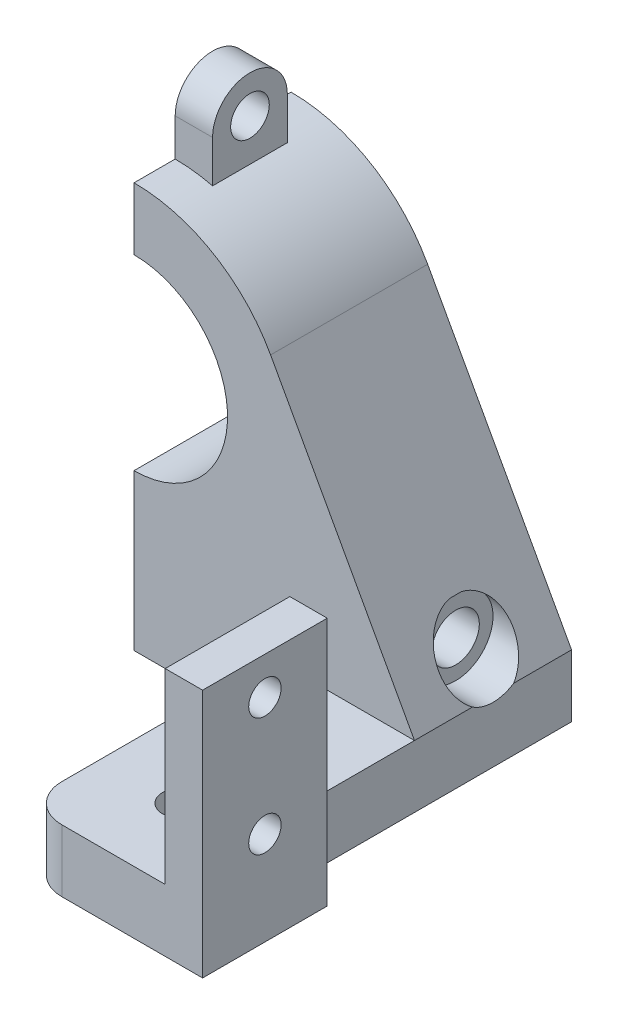
ISO-10303-21;
HEADER;
FILE_DESCRIPTION(('STEP AP214'),'2;1');
FILE_NAME('part.step','',(''),(''),'','','');
FILE_SCHEMA(('AUTOMOTIVE_DESIGN { 1 0 10303 214 1 1 1 1 }'));
ENDSEC;
DATA;
#1=APPLICATION_CONTEXT('core data for automotive mechanical design processes');
#2=APPLICATION_PROTOCOL_DEFINITION('international standard','automotive_design',2000,#1);
#3=PRODUCT_CONTEXT('',#1,'mechanical');
#4=PRODUCT('Part','Part','',(#3));
#5=PRODUCT_RELATED_PRODUCT_CATEGORY('part','',(#4));
#6=PRODUCT_DEFINITION_FORMATION('','',#4);
#7=PRODUCT_DEFINITION_CONTEXT('part definition',#1,'design');
#8=PRODUCT_DEFINITION('design','',#6,#7);
#9=PRODUCT_DEFINITION_SHAPE('','',#8);
#10=(LENGTH_UNIT() NAMED_UNIT(*) SI_UNIT(.MILLI.,.METRE.));
#11=(NAMED_UNIT(*) PLANE_ANGLE_UNIT() SI_UNIT($,.RADIAN.));
#12=(NAMED_UNIT(*) SI_UNIT($,.STERADIAN.) SOLID_ANGLE_UNIT());
#13=UNCERTAINTY_MEASURE_WITH_UNIT(LENGTH_MEASURE(1.E-05),#10,'distance_accuracy_value','');
#14=(GEOMETRIC_REPRESENTATION_CONTEXT(3) GLOBAL_UNCERTAINTY_ASSIGNED_CONTEXT((#13)) GLOBAL_UNIT_ASSIGNED_CONTEXT((#10,
#11,#12)) REPRESENTATION_CONTEXT('',''));
#15=CARTESIAN_POINT('',(0.,0.,0.));
#16=DIRECTION('',(0.,0.,1.));
#17=DIRECTION('',(1.,0.,0.));
#18=AXIS2_PLACEMENT_3D('',#15,#16,#17);
#19=CARTESIAN_POINT('',(25.5,-12.5,6.3));
#20=DIRECTION('',(-1.,0.,0.));
#21=DIRECTION('',(0.,0.,1.));
#22=AXIS2_PLACEMENT_3D('',#19,#20,#21);
#23=CYLINDRICAL_SURFACE('',#22,1.90095655825944);
#24=CARTESIAN_POINT('',(0.,-12.5,6.3));
#25=DIRECTION('',(1.,0.,0.));
#26=DIRECTION('',(0.,0.,-1.));
#27=AXIS2_PLACEMENT_3D('',#24,#25,#26);
#28=CIRCLE('',#27,1.90095655825944);
#29=CARTESIAN_POINT('',(0.,-12.5,4.39904344174055));
#30=VERTEX_POINT('',#29);
#31=EDGE_CURVE('E193',#30,#30,#28,.T.);
#32=ORIENTED_EDGE('',*,*,#31,.F.);
#33=EDGE_LOOP('',(#32));
#34=FACE_BOUND('',#33,.T.);
#35=CARTESIAN_POINT('',(19.5,-12.5,6.3));
#36=DIRECTION('',(1.,0.,0.));
#37=DIRECTION('',(0.,0.,-1.));
#38=AXIS2_PLACEMENT_3D('',#35,#36,#37);
#39=CIRCLE('',#38,1.90095655825944);
#40=CARTESIAN_POINT('',(19.5,-12.5,4.39904344174055));
#41=VERTEX_POINT('',#40);
#42=EDGE_CURVE('E194',#41,#41,#39,.T.);
#43=ORIENTED_EDGE('',*,*,#42,.T.);
#44=EDGE_LOOP('',(#43));
#45=FACE_BOUND('',#44,.T.);
#46=ADVANCED_FACE('F51',(#34,#45),#23,.F.);
#47=CARTESIAN_POINT('',(0.,0.,12.6));
#48=DIRECTION('',(0.,0.,-1.));
#49=DIRECTION('',(-1.,0.,0.));
#50=AXIS2_PLACEMENT_3D('',#47,#48,#49);
#51=CYLINDRICAL_SURFACE('',#50,12.5);
#52=CARTESIAN_POINT('',(0.,0.,3.3));
#53=DIRECTION('',(0.,0.,1.));
#54=DIRECTION('',(1.,0.,0.));
#55=AXIS2_PLACEMENT_3D('',#52,#53,#54);
#56=CIRCLE('',#55,12.5);
#57=CARTESIAN_POINT('',(3.,12.1346610995116,3.3));
#58=VERTEX_POINT('',#57);
#59=CARTESIAN_POINT('',(0.,12.5,3.3));
#60=VERTEX_POINT('',#59);
#61=EDGE_CURVE('E416',#58,#60,#56,.T.);
#62=ORIENTED_EDGE('',*,*,#61,.F.);
#63=DIRECTION('',(0.,0.,-1.));
#64=VECTOR('',#63,1.);
#65=CARTESIAN_POINT('',(3.,12.1346610995116,12.6));
#66=LINE('',#65,#64);
#67=CARTESIAN_POINT('',(3.,12.1346610995116,9.3));
#68=VERTEX_POINT('',#67);
#69=EDGE_CURVE('E74',#58,#68,#66,.F.);
#70=ORIENTED_EDGE('',*,*,#69,.T.);
#71=CARTESIAN_POINT('',(0.,0.,9.3));
#72=DIRECTION('',(0.,0.,-1.));
#73=DIRECTION('',(-1.,0.,0.));
#74=AXIS2_PLACEMENT_3D('',#71,#72,#73);
#75=CIRCLE('',#74,12.5);
#76=CARTESIAN_POINT('',(0.,12.5,9.3));
#77=VERTEX_POINT('',#76);
#78=EDGE_CURVE('E428',#77,#68,#75,.T.);
#79=ORIENTED_EDGE('',*,*,#78,.F.);
#80=DIRECTION('',(0.,0.,-1.));
#81=VECTOR('',#80,1.);
#82=CARTESIAN_POINT('',(0.,12.5,12.6));
#83=LINE('',#82,#81);
#84=CARTESIAN_POINT('',(0.,12.5,12.6));
#85=VERTEX_POINT('',#84);
#86=EDGE_CURVE('E423',#77,#85,#83,.F.);
#87=ORIENTED_EDGE('',*,*,#86,.T.);
#88=CARTESIAN_POINT('',(0.,0.,12.6));
#89=DIRECTION('',(0.,0.,1.));
#90=DIRECTION('',(1.,0.,0.));
#91=AXIS2_PLACEMENT_3D('',#88,#89,#90);
#92=CIRCLE('',#91,12.5);
#93=CARTESIAN_POINT('',(10.9561942606573,6.01762472431933,12.6));
#94=VERTEX_POINT('',#93);
#95=EDGE_CURVE('E372',#94,#85,#92,.T.);
#96=ORIENTED_EDGE('',*,*,#95,.F.);
#97=DIRECTION('',(0.,0.,-1.));
#98=VECTOR('',#97,1.);
#99=CARTESIAN_POINT('',(10.9561942606573,6.01762472431933,12.6));
#100=LINE('',#99,#98);
#101=CARTESIAN_POINT('',(10.9561942606573,6.01762472431933,0.));
#102=VERTEX_POINT('',#101);
#103=EDGE_CURVE('E223',#94,#102,#100,.T.);
#104=ORIENTED_EDGE('',*,*,#103,.T.);
#105=CARTESIAN_POINT('',(0.,0.,0.));
#106=DIRECTION('',(0.,0.,1.));
#107=DIRECTION('',(1.,0.,0.));
#108=AXIS2_PLACEMENT_3D('',#105,#106,#107);
#109=CIRCLE('',#108,12.5);
#110=CARTESIAN_POINT('',(0.,12.5,0.));
#111=VERTEX_POINT('',#110);
#112=EDGE_CURVE('E385',#102,#111,#109,.T.);
#113=ORIENTED_EDGE('',*,*,#112,.T.);
#114=EDGE_CURVE('E431',#111,#60,#83,.F.);
#115=ORIENTED_EDGE('',*,*,#114,.T.);
#116=EDGE_LOOP('',(#62,#70,#79,#87,#96,#104,#113,#115));
#117=FACE_BOUND('',#116,.T.);
#118=ADVANCED_FACE('F265',(#117),#51,.T.);
#119=CARTESIAN_POINT('',(22.5,-15.,12.6));
#120=DIRECTION('',(-1.,0.,0.));
#121=DIRECTION('',(0.,0.,1.));
#122=AXIS2_PLACEMENT_3D('',#119,#120,#121);
#123=PLANE('',#122);
#124=DIRECTION('',(0.,0.,-1.));
#125=VECTOR('',#124,1.);
#126=CARTESIAN_POINT('',(22.5,-15.,12.6));
#127=LINE('',#126,#125);
#128=CARTESIAN_POINT('',(22.5,-15.,4.64168760482227));
#129=VERTEX_POINT('',#128);
#130=CARTESIAN_POINT('',(22.5,-15.,0.));
#131=VERTEX_POINT('',#130);
#132=EDGE_CURVE('E213',#129,#131,#127,.T.);
#133=ORIENTED_EDGE('',*,*,#132,.F.);
#134=CARTESIAN_POINT('',(22.5,-12.5,6.3));
#135=DIRECTION('',(1.,0.,0.));
#136=DIRECTION('',(0.,0.,-1.));
#137=AXIS2_PLACEMENT_3D('',#134,#135,#136);
#138=CIRCLE('',#137,3.);
#139=CARTESIAN_POINT('',(22.5,-15.,7.95831239517772));
#140=VERTEX_POINT('',#139);
#141=EDGE_CURVE('E200',#140,#129,#138,.T.);
#142=ORIENTED_EDGE('',*,*,#141,.F.);
#143=CARTESIAN_POINT('',(22.5,-15.,12.6));
#144=VERTEX_POINT('',#143);
#145=EDGE_CURVE('E206',#144,#140,#127,.T.);
#146=ORIENTED_EDGE('',*,*,#145,.F.);
#147=DIRECTION('',(0.,0.,-1.));
#148=VECTOR('',#147,1.);
#149=CARTESIAN_POINT('',(22.5,-15.,32.6));
#150=LINE('',#149,#148);
#151=CARTESIAN_POINT('',(22.5,-15.,22.6));
#152=VERTEX_POINT('',#151);
#153=EDGE_CURVE('E231',#152,#144,#150,.T.);
#154=ORIENTED_EDGE('',*,*,#153,.F.);
#155=DIRECTION('',(0.,1.,0.));
#156=VECTOR('',#155,1.);
#157=CARTESIAN_POINT('',(22.5,-20.,22.6));
#158=LINE('',#157,#156);
#159=CARTESIAN_POINT('',(22.5,-20.,22.6));
#160=VERTEX_POINT('',#159);
#161=EDGE_CURVE('E492',#160,#152,#158,.T.);
#162=ORIENTED_EDGE('',*,*,#161,.F.);
#163=DIRECTION('',(0.,0.,-1.));
#164=VECTOR('',#163,1.);
#165=CARTESIAN_POINT('',(22.5,-20.,12.6));
#166=LINE('',#165,#164);
#167=CARTESIAN_POINT('',(22.5,-20.,0.));
#168=VERTEX_POINT('',#167);
#169=EDGE_CURVE('E212',#160,#168,#166,.T.);
#170=ORIENTED_EDGE('',*,*,#169,.T.);
#171=DIRECTION('',(0.,1.,0.));
#172=VECTOR('',#171,1.);
#173=CARTESIAN_POINT('',(22.5,-15.,0.));
#174=LINE('',#173,#172);
#175=EDGE_CURVE('E393',#168,#131,#174,.T.);
#176=ORIENTED_EDGE('',*,*,#175,.T.);
#177=EDGE_LOOP('',(#133,#142,#146,#154,#162,#170,#176));
#178=FACE_BOUND('',#177,.T.);
#179=ADVANCED_FACE('F270',(#178),#123,.F.);
#180=CARTESIAN_POINT('',(0.,0.,12.6));
#181=DIRECTION('',(0.,0.,1.));
#182=DIRECTION('',(1.,0.,0.));
#183=AXIS2_PLACEMENT_3D('',#180,#181,#182);
#184=PLANE('',#183);
#185=DIRECTION('',(0.,1.,0.));
#186=VECTOR('',#185,1.);
#187=CARTESIAN_POINT('',(0.,0.,12.6));
#188=LINE('',#187,#186);
#189=CARTESIAN_POINT('',(0.,-20.,12.6));
#190=VERTEX_POINT('',#189);
#191=CARTESIAN_POINT('',(0.,-7.5,12.6));
#192=VERTEX_POINT('',#191);
#193=EDGE_CURVE('E425',#190,#192,#188,.T.);
#194=ORIENTED_EDGE('',*,*,#193,.F.);
#195=DIRECTION('',(1.,0.,0.));
#196=VECTOR('',#195,1.);
#197=CARTESIAN_POINT('',(-22.5,-20.,12.6));
#198=LINE('',#197,#196);
#199=CARTESIAN_POINT('',(11.2082511185139,-20.,12.6));
#200=VERTEX_POINT('',#199);
#201=EDGE_CURVE('E363',#190,#200,#198,.T.);
#202=ORIENTED_EDGE('',*,*,#201,.T.);
#203=DIRECTION('',(0.,1.,0.));
#204=VECTOR('',#203,1.);
#205=CARTESIAN_POINT('',(11.2082511185139,0.,12.6));
#206=LINE('',#205,#204);
#207=CARTESIAN_POINT('',(11.2082511185139,-15.,12.6));
#208=VERTEX_POINT('',#207);
#209=EDGE_CURVE('E515',#200,#208,#206,.T.);
#210=ORIENTED_EDGE('',*,*,#209,.T.);
#211=DIRECTION('',(1.,0.,0.));
#212=VECTOR('',#211,1.);
#213=CARTESIAN_POINT('',(0.,-15.,12.6));
#214=LINE('',#213,#212);
#215=EDGE_CURVE('E511',#208,#144,#214,.T.);
#216=ORIENTED_EDGE('',*,*,#215,.T.);
#217=DIRECTION('',(-0.481409977945547,0.876495540852586,0.));
#218=VECTOR('',#217,1.);
#219=CARTESIAN_POINT('',(10.9561942606573,6.01762472431933,12.6));
#220=LINE('',#219,#218);
#221=EDGE_CURVE('E208',#144,#94,#220,.T.);
#222=ORIENTED_EDGE('',*,*,#221,.T.);
#223=ORIENTED_EDGE('',*,*,#95,.T.);
#224=CARTESIAN_POINT('',(0.,7.5,12.6));
#225=VERTEX_POINT('',#224);
#226=EDGE_CURVE('E415',#225,#85,#188,.T.);
#227=ORIENTED_EDGE('',*,*,#226,.F.);
#228=CARTESIAN_POINT('',(0.,0.,12.6));
#229=DIRECTION('',(0.,0.,1.));
#230=DIRECTION('',(1.,0.,0.));
#231=AXIS2_PLACEMENT_3D('',#228,#229,#230);
#232=CIRCLE('',#231,7.5);
#233=EDGE_CURVE('E390',#192,#225,#232,.T.);
#234=ORIENTED_EDGE('',*,*,#233,.F.);
#235=EDGE_LOOP('',(#194,#202,#210,#216,#222,#223,#227,#234));
#236=FACE_BOUND('',#235,.T.);
#237=ADVANCED_FACE('F341',(#236),#184,.T.);
#238=CARTESIAN_POINT('',(0.,0.,0.));
#239=DIRECTION('',(0.,0.,1.));
#240=DIRECTION('',(1.,0.,0.));
#241=AXIS2_PLACEMENT_3D('',#238,#239,#240);
#242=PLANE('',#241);
#243=DIRECTION('',(1.,0.,0.));
#244=VECTOR('',#243,1.);
#245=CARTESIAN_POINT('',(-22.5,-20.,0.));
#246=LINE('',#245,#244);
#247=CARTESIAN_POINT('',(0.,-20.,0.));
#248=VERTEX_POINT('',#247);
#249=EDGE_CURVE('E389',#248,#168,#246,.T.);
#250=ORIENTED_EDGE('',*,*,#249,.F.);
#251=DIRECTION('',(0.,1.,0.));
#252=VECTOR('',#251,1.);
#253=CARTESIAN_POINT('',(0.,0.,0.));
#254=LINE('',#253,#252);
#255=CARTESIAN_POINT('',(0.,-7.5,0.));
#256=VERTEX_POINT('',#255);
#257=EDGE_CURVE('E418',#248,#256,#254,.T.);
#258=ORIENTED_EDGE('',*,*,#257,.T.);
#259=CARTESIAN_POINT('',(0.,0.,0.));
#260=DIRECTION('',(0.,0.,1.));
#261=DIRECTION('',(1.,0.,0.));
#262=AXIS2_PLACEMENT_3D('',#259,#260,#261);
#263=CIRCLE('',#262,7.5);
#264=CARTESIAN_POINT('',(0.,7.5,0.));
#265=VERTEX_POINT('',#264);
#266=EDGE_CURVE('E411',#256,#265,#263,.T.);
#267=ORIENTED_EDGE('',*,*,#266,.T.);
#268=EDGE_CURVE('E408',#265,#111,#254,.T.);
#269=ORIENTED_EDGE('',*,*,#268,.T.);
#270=ORIENTED_EDGE('',*,*,#112,.F.);
#271=DIRECTION('',(-0.481409977945547,0.876495540852586,0.));
#272=VECTOR('',#271,1.);
#273=CARTESIAN_POINT('',(10.9561942606573,6.01762472431933,0.));
#274=LINE('',#273,#272);
#275=EDGE_CURVE('E381',#131,#102,#274,.T.);
#276=ORIENTED_EDGE('',*,*,#275,.F.);
#277=ORIENTED_EDGE('',*,*,#175,.F.);
#278=EDGE_LOOP('',(#250,#258,#267,#269,#270,#276,#277));
#279=FACE_BOUND('',#278,.T.);
#280=ADVANCED_FACE('F344',(#279),#242,.F.);
#281=CARTESIAN_POINT('',(-22.5,-20.,12.6));
#282=DIRECTION('',(0.,1.,0.));
#283=DIRECTION('',(-1.,0.,0.));
#284=AXIS2_PLACEMENT_3D('',#281,#282,#283);
#285=PLANE('',#284);
#286=CARTESIAN_POINT('',(17.5,-20.,26.3));
#287=DIRECTION('',(0.,1.,0.));
#288=DIRECTION('',(0.,0.,-1.));
#289=AXIS2_PLACEMENT_3D('',#286,#287,#288);
#290=CIRCLE('',#289,1.5);
#291=CARTESIAN_POINT('',(17.5,-20.,24.8));
#292=VERTEX_POINT('',#291);
#293=EDGE_CURVE('E232',#292,#292,#290,.T.);
#294=ORIENTED_EDGE('',*,*,#293,.T.);
#295=EDGE_LOOP('',(#294));
#296=FACE_BOUND('',#295,.T.);
#297=ORIENTED_EDGE('',*,*,#201,.F.);
#298=DIRECTION('',(0.,0.,-1.));
#299=VECTOR('',#298,1.);
#300=CARTESIAN_POINT('',(0.,-20.,12.6));
#301=LINE('',#300,#299);
#302=EDGE_CURVE('E364',#190,#248,#301,.T.);
#303=ORIENTED_EDGE('',*,*,#302,.T.);
#304=ORIENTED_EDGE('',*,*,#249,.T.);
#305=ORIENTED_EDGE('',*,*,#169,.F.);
#306=DIRECTION('',(-1.,0.,0.));
#307=VECTOR('',#306,1.);
#308=CARTESIAN_POINT('',(25.5,-20.,22.6));
#309=LINE('',#308,#307);
#310=CARTESIAN_POINT('',(25.5,-20.,22.6));
#311=VERTEX_POINT('',#310);
#312=EDGE_CURVE('E460',#311,#160,#309,.T.);
#313=ORIENTED_EDGE('',*,*,#312,.F.);
#314=DIRECTION('',(0.,0.,-1.));
#315=VECTOR('',#314,1.);
#316=CARTESIAN_POINT('',(25.5,-20.,32.6));
#317=LINE('',#316,#315);
#318=CARTESIAN_POINT('',(25.5,-20.,32.6));
#319=VERTEX_POINT('',#318);
#320=EDGE_CURVE('E464',#319,#311,#317,.T.);
#321=ORIENTED_EDGE('',*,*,#320,.F.);
#322=DIRECTION('',(1.,0.,0.));
#323=VECTOR('',#322,1.);
#324=CARTESIAN_POINT('',(11.2082511185139,-20.,32.6));
#325=LINE('',#324,#323);
#326=CARTESIAN_POINT('',(14.2082511185139,-20.,32.6));
#327=VERTEX_POINT('',#326);
#328=EDGE_CURVE('E509',#327,#319,#325,.T.);
#329=ORIENTED_EDGE('',*,*,#328,.F.);
#330=CARTESIAN_POINT('',(14.2082511185139,-20.,29.6));
#331=DIRECTION('',(0.,1.,0.));
#332=DIRECTION('',(-1.,0.,0.));
#333=AXIS2_PLACEMENT_3D('',#330,#331,#332);
#334=CIRCLE('',#333,3.);
#335=CARTESIAN_POINT('',(11.2082511185139,-20.,29.6));
#336=VERTEX_POINT('',#335);
#337=EDGE_CURVE('E236',#327,#336,#334,.F.);
#338=ORIENTED_EDGE('',*,*,#337,.T.);
#339=DIRECTION('',(0.,0.,-1.));
#340=VECTOR('',#339,1.);
#341=CARTESIAN_POINT('',(11.2082511185139,-20.,32.6));
#342=LINE('',#341,#340);
#343=EDGE_CURVE('E367',#336,#200,#342,.T.);
#344=ORIENTED_EDGE('',*,*,#343,.T.);
#345=EDGE_LOOP('',(#297,#303,#304,#305,#313,#321,#329,#338,#344));
#346=FACE_BOUND('',#345,.T.);
#347=ADVANCED_FACE('F348',(#296,#346),#285,.F.);
#348=CARTESIAN_POINT('',(10.9561942606573,6.01762472431933,12.6));
#349=DIRECTION('',(-0.876495540852587,-0.481409977945547,0.));
#350=DIRECTION('',(0.481409977945547,-0.876495540852587,0.));
#351=AXIS2_PLACEMENT_3D('',#348,#349,#350);
#352=PLANE('',#351);
#353=ORIENTED_EDGE('',*,*,#145,.T.);
#354=CARTESIAN_POINT('',(21.1268898257107,-12.5,6.3));
#355=DIRECTION('',(-0.876495540852587,-0.481409977945547,0.));
#356=DIRECTION('',(0.481409977945547,-0.876495540852587,0.));
#357=AXIS2_PLACEMENT_3D('',#354,#355,#356);
#358=ELLIPSE('',#357,3.42272134902345,3.);
#359=CARTESIAN_POINT('',(19.5,-9.53794739822532,6.77565153665245));
#360=VERTEX_POINT('',#359);
#361=EDGE_CURVE('E11',#140,#360,#358,.T.);
#362=ORIENTED_EDGE('',*,*,#361,.T.);
#363=DIRECTION('',(0.,0.,1.));
#364=VECTOR('',#363,1.);
#365=CARTESIAN_POINT('',(19.5,-9.53794739822532,12.6));
#366=LINE('',#365,#364);
#367=CARTESIAN_POINT('',(19.5,-9.53794739822532,5.82434846334754));
#368=VERTEX_POINT('',#367);
#369=EDGE_CURVE('E188',#368,#360,#366,.T.);
#370=ORIENTED_EDGE('',*,*,#369,.F.);
#371=EDGE_CURVE('E55',#368,#129,#358,.T.);
#372=ORIENTED_EDGE('',*,*,#371,.T.);
#373=ORIENTED_EDGE('',*,*,#132,.T.);
#374=ORIENTED_EDGE('',*,*,#275,.T.);
#375=ORIENTED_EDGE('',*,*,#103,.F.);
#376=ORIENTED_EDGE('',*,*,#221,.F.);
#377=EDGE_LOOP('',(#353,#362,#370,#372,#373,#374,#375,#376));
#378=FACE_BOUND('',#377,.T.);
#379=ADVANCED_FACE('F203',(#378),#352,.F.);
#380=CARTESIAN_POINT('',(0.,0.,12.6));
#381=DIRECTION('',(0.,0.,-1.));
#382=DIRECTION('',(-1.,0.,0.));
#383=AXIS2_PLACEMENT_3D('',#380,#381,#382);
#384=CYLINDRICAL_SURFACE('',#383,7.5);
#385=DIRECTION('',(0.,0.,-1.));
#386=VECTOR('',#385,1.);
#387=CARTESIAN_POINT('',(0.,-7.5,12.6));
#388=LINE('',#387,#386);
#389=EDGE_CURVE('E247',#192,#256,#388,.T.);
#390=ORIENTED_EDGE('',*,*,#389,.F.);
#391=ORIENTED_EDGE('',*,*,#233,.T.);
#392=DIRECTION('',(0.,0.,-1.));
#393=VECTOR('',#392,1.);
#394=CARTESIAN_POINT('',(0.,7.5,12.6));
#395=LINE('',#394,#393);
#396=EDGE_CURVE('E244',#265,#225,#395,.F.);
#397=ORIENTED_EDGE('',*,*,#396,.F.);
#398=ORIENTED_EDGE('',*,*,#266,.F.);
#399=EDGE_LOOP('',(#390,#391,#397,#398));
#400=FACE_BOUND('',#399,.T.);
#401=ADVANCED_FACE('F330',(#400),#384,.F.);
#402=CARTESIAN_POINT('',(22.5,-15.,32.6));
#403=DIRECTION('',(0.,-1.,0.));
#404=DIRECTION('',(1.,0.,0.));
#405=AXIS2_PLACEMENT_3D('',#402,#403,#404);
#406=PLANE('',#405);
#407=CARTESIAN_POINT('',(17.5,-15.,26.3));
#408=DIRECTION('',(0.,-1.,0.));
#409=DIRECTION('',(1.,0.,0.));
#410=AXIS2_PLACEMENT_3D('',#407,#408,#409);
#411=CIRCLE('',#410,1.5);
#412=CARTESIAN_POINT('',(19.,-15.,26.3));
#413=VERTEX_POINT('',#412);
#414=EDGE_CURVE('E227',#413,#413,#411,.T.);
#415=ORIENTED_EDGE('',*,*,#414,.T.);
#416=EDGE_LOOP('',(#415));
#417=FACE_BOUND('',#416,.T.);
#418=DIRECTION('',(0.,0.,-1.));
#419=VECTOR('',#418,1.);
#420=CARTESIAN_POINT('',(11.2082511185139,-15.,32.6));
#421=LINE('',#420,#419);
#422=CARTESIAN_POINT('',(11.2082511185139,-15.,29.6));
#423=VERTEX_POINT('',#422);
#424=EDGE_CURVE('E500',#423,#208,#421,.T.);
#425=ORIENTED_EDGE('',*,*,#424,.F.);
#426=CARTESIAN_POINT('',(14.2082511185139,-15.,29.6));
#427=DIRECTION('',(0.,-1.,0.));
#428=DIRECTION('',(1.,0.,0.));
#429=AXIS2_PLACEMENT_3D('',#426,#427,#428);
#430=CIRCLE('',#429,3.);
#431=CARTESIAN_POINT('',(14.2082511185139,-15.,32.6));
#432=VERTEX_POINT('',#431);
#433=EDGE_CURVE('E241',#423,#432,#430,.F.);
#434=ORIENTED_EDGE('',*,*,#433,.T.);
#435=DIRECTION('',(-1.,0.,0.));
#436=VECTOR('',#435,1.);
#437=CARTESIAN_POINT('',(22.5,-15.,32.6));
#438=LINE('',#437,#436);
#439=CARTESIAN_POINT('',(22.5,-15.,32.6));
#440=VERTEX_POINT('',#439);
#441=EDGE_CURVE('E505',#440,#432,#438,.T.);
#442=ORIENTED_EDGE('',*,*,#441,.F.);
#443=EDGE_CURVE('E497',#440,#152,#150,.T.);
#444=ORIENTED_EDGE('',*,*,#443,.T.);
#445=ORIENTED_EDGE('',*,*,#153,.T.);
#446=ORIENTED_EDGE('',*,*,#215,.F.);
#447=EDGE_LOOP('',(#425,#434,#442,#444,#445,#446));
#448=FACE_BOUND('',#447,.T.);
#449=ADVANCED_FACE('F326',(#417,#448),#406,.F.);
#450=CARTESIAN_POINT('',(11.2082511185139,-15.,32.6));
#451=DIRECTION('',(1.,0.,0.));
#452=DIRECTION('',(0.,0.,-1.));
#453=AXIS2_PLACEMENT_3D('',#450,#451,#452);
#454=PLANE('',#453);
#455=ORIENTED_EDGE('',*,*,#343,.F.);
#456=DIRECTION('',(0.,-1.,0.));
#457=VECTOR('',#456,1.);
#458=CARTESIAN_POINT('',(11.2082511185139,-15.,29.6));
#459=LINE('',#458,#457);
#460=EDGE_CURVE('E238',#336,#423,#459,.F.);
#461=ORIENTED_EDGE('',*,*,#460,.T.);
#462=ORIENTED_EDGE('',*,*,#424,.T.);
#463=ORIENTED_EDGE('',*,*,#209,.F.);
#464=EDGE_LOOP('',(#455,#461,#462,#463));
#465=FACE_BOUND('',#464,.T.);
#466=ADVANCED_FACE('F329',(#465),#454,.F.);
#467=CARTESIAN_POINT('',(0.,0.,32.6));
#468=DIRECTION('',(0.,0.,1.));
#469=DIRECTION('',(1.,0.,0.));
#470=AXIS2_PLACEMENT_3D('',#467,#468,#469);
#471=PLANE('',#470);
#472=ORIENTED_EDGE('',*,*,#441,.T.);
#473=DIRECTION('',(0.,-1.,0.));
#474=VECTOR('',#473,1.);
#475=CARTESIAN_POINT('',(14.2082511185139,-20.,32.6));
#476=LINE('',#475,#474);
#477=EDGE_CURVE('E220',#432,#327,#476,.T.);
#478=ORIENTED_EDGE('',*,*,#477,.T.);
#479=ORIENTED_EDGE('',*,*,#328,.T.);
#480=DIRECTION('',(0.,1.,0.));
#481=VECTOR('',#480,1.);
#482=CARTESIAN_POINT('',(25.5,-20.,32.6));
#483=LINE('',#482,#481);
#484=CARTESIAN_POINT('',(25.5,0.,32.6));
#485=VERTEX_POINT('',#484);
#486=EDGE_CURVE('E486',#319,#485,#483,.T.);
#487=ORIENTED_EDGE('',*,*,#486,.T.);
#488=DIRECTION('',(1.,0.,0.));
#489=VECTOR('',#488,1.);
#490=CARTESIAN_POINT('',(22.5,0.,32.6));
#491=LINE('',#490,#489);
#492=CARTESIAN_POINT('',(22.5,0.,32.6));
#493=VERTEX_POINT('',#492);
#494=EDGE_CURVE('E477',#493,#485,#491,.T.);
#495=ORIENTED_EDGE('',*,*,#494,.F.);
#496=DIRECTION('',(0.,1.,0.));
#497=VECTOR('',#496,1.);
#498=CARTESIAN_POINT('',(22.5,-20.,32.6));
#499=LINE('',#498,#497);
#500=EDGE_CURVE('E489',#440,#493,#499,.T.);
#501=ORIENTED_EDGE('',*,*,#500,.F.);
#502=EDGE_LOOP('',(#472,#478,#479,#487,#495,#501));
#503=FACE_BOUND('',#502,.T.);
#504=ADVANCED_FACE('F324',(#503),#471,.T.);
#505=CARTESIAN_POINT('',(17.5,-20.,26.3));
#506=DIRECTION('',(0.,1.,0.));
#507=DIRECTION('',(0.,0.,1.));
#508=AXIS2_PLACEMENT_3D('',#505,#506,#507);
#509=CYLINDRICAL_SURFACE('',#508,1.5);
#510=ORIENTED_EDGE('',*,*,#293,.F.);
#511=EDGE_LOOP('',(#510));
#512=FACE_BOUND('',#511,.T.);
#513=ORIENTED_EDGE('',*,*,#414,.F.);
#514=EDGE_LOOP('',(#513));
#515=FACE_BOUND('',#514,.T.);
#516=ADVANCED_FACE('F321',(#512,#515),#509,.F.);
#517=CARTESIAN_POINT('',(14.2082511185139,0.,29.6));
#518=DIRECTION('',(0.,1.,0.));
#519=DIRECTION('',(0.,0.,1.));
#520=AXIS2_PLACEMENT_3D('',#517,#518,#519);
#521=CYLINDRICAL_SURFACE('',#520,3.);
#522=ORIENTED_EDGE('',*,*,#433,.F.);
#523=ORIENTED_EDGE('',*,*,#460,.F.);
#524=ORIENTED_EDGE('',*,*,#337,.F.);
#525=ORIENTED_EDGE('',*,*,#477,.F.);
#526=EDGE_LOOP('',(#522,#523,#524,#525));
#527=FACE_BOUND('',#526,.T.);
#528=ADVANCED_FACE('F53',(#527),#521,.T.);
#529=CARTESIAN_POINT('',(22.5,-20.,22.6));
#530=DIRECTION('',(-1.,0.,0.));
#531=DIRECTION('',(0.,0.,1.));
#532=AXIS2_PLACEMENT_3D('',#529,#530,#531);
#533=PLANE('',#532);
#534=CARTESIAN_POINT('',(22.5,-3.,27.6));
#535=DIRECTION('',(-1.,0.,0.));
#536=DIRECTION('',(0.,0.,1.));
#537=AXIS2_PLACEMENT_3D('',#534,#535,#536);
#538=CIRCLE('',#537,1.3);
#539=CARTESIAN_POINT('',(22.5,-3.,28.9));
#540=VERTEX_POINT('',#539);
#541=EDGE_CURVE('E455',#540,#540,#538,.F.);
#542=ORIENTED_EDGE('',*,*,#541,.T.);
#543=EDGE_LOOP('',(#542));
#544=FACE_BOUND('',#543,.T.);
#545=CARTESIAN_POINT('',(22.5,-12.5,27.6));
#546=DIRECTION('',(-1.,0.,0.));
#547=DIRECTION('',(0.,0.,1.));
#548=AXIS2_PLACEMENT_3D('',#545,#546,#547);
#549=CIRCLE('',#548,1.3);
#550=CARTESIAN_POINT('',(22.5,-12.5,28.9));
#551=VERTEX_POINT('',#550);
#552=EDGE_CURVE('E448',#551,#551,#549,.F.);
#553=ORIENTED_EDGE('',*,*,#552,.T.);
#554=EDGE_LOOP('',(#553));
#555=FACE_BOUND('',#554,.T.);
#556=ORIENTED_EDGE('',*,*,#443,.F.);
#557=ORIENTED_EDGE('',*,*,#500,.T.);
#558=DIRECTION('',(0.,0.,1.));
#559=VECTOR('',#558,1.);
#560=CARTESIAN_POINT('',(22.5,0.,22.6));
#561=LINE('',#560,#559);
#562=CARTESIAN_POINT('',(22.5,0.,22.6));
#563=VERTEX_POINT('',#562);
#564=EDGE_CURVE('E473',#563,#493,#561,.T.);
#565=ORIENTED_EDGE('',*,*,#564,.F.);
#566=EDGE_CURVE('E469',#152,#563,#158,.T.);
#567=ORIENTED_EDGE('',*,*,#566,.F.);
#568=EDGE_LOOP('',(#556,#557,#565,#567));
#569=FACE_BOUND('',#568,.T.);
#570=ADVANCED_FACE('F314',(#544,#555,#569),#533,.T.);
#571=CARTESIAN_POINT('',(25.5,-20.,22.6));
#572=DIRECTION('',(0.,0.,-1.));
#573=DIRECTION('',(-1.,0.,0.));
#574=AXIS2_PLACEMENT_3D('',#571,#572,#573);
#575=PLANE('',#574);
#576=DIRECTION('',(-1.,0.,0.));
#577=VECTOR('',#576,1.);
#578=CARTESIAN_POINT('',(25.5,0.,22.6));
#579=LINE('',#578,#577);
#580=CARTESIAN_POINT('',(25.5,0.,22.6));
#581=VERTEX_POINT('',#580);
#582=EDGE_CURVE('E459',#581,#563,#579,.T.);
#583=ORIENTED_EDGE('',*,*,#582,.F.);
#584=DIRECTION('',(0.,1.,0.));
#585=VECTOR('',#584,1.);
#586=CARTESIAN_POINT('',(25.5,-20.,22.6));
#587=LINE('',#586,#585);
#588=EDGE_CURVE('E483',#311,#581,#587,.T.);
#589=ORIENTED_EDGE('',*,*,#588,.F.);
#590=ORIENTED_EDGE('',*,*,#312,.T.);
#591=ORIENTED_EDGE('',*,*,#161,.T.);
#592=ORIENTED_EDGE('',*,*,#566,.T.);
#593=EDGE_LOOP('',(#583,#589,#590,#591,#592));
#594=FACE_BOUND('',#593,.T.);
#595=ADVANCED_FACE('F312',(#594),#575,.T.);
#596=CARTESIAN_POINT('',(25.5,-20.,32.6));
#597=DIRECTION('',(1.,0.,0.));
#598=DIRECTION('',(0.,0.,-1.));
#599=AXIS2_PLACEMENT_3D('',#596,#597,#598);
#600=PLANE('',#599);
#601=CARTESIAN_POINT('',(25.5,-3.,27.6));
#602=DIRECTION('',(1.,0.,0.));
#603=DIRECTION('',(0.,0.,-1.));
#604=AXIS2_PLACEMENT_3D('',#601,#602,#603);
#605=CIRCLE('',#604,1.3);
#606=CARTESIAN_POINT('',(25.5,-3.,26.3));
#607=VERTEX_POINT('',#606);
#608=EDGE_CURVE('E444',#607,#607,#605,.T.);
#609=ORIENTED_EDGE('',*,*,#608,.F.);
#610=EDGE_LOOP('',(#609));
#611=FACE_BOUND('',#610,.T.);
#612=CARTESIAN_POINT('',(25.5,-12.5,27.6));
#613=DIRECTION('',(1.,0.,0.));
#614=DIRECTION('',(0.,0.,-1.));
#615=AXIS2_PLACEMENT_3D('',#612,#613,#614);
#616=CIRCLE('',#615,1.3);
#617=CARTESIAN_POINT('',(25.5,-12.5,26.3));
#618=VERTEX_POINT('',#617);
#619=EDGE_CURVE('E443',#618,#618,#616,.T.);
#620=ORIENTED_EDGE('',*,*,#619,.F.);
#621=EDGE_LOOP('',(#620));
#622=FACE_BOUND('',#621,.T.);
#623=DIRECTION('',(0.,0.,-1.));
#624=VECTOR('',#623,1.);
#625=CARTESIAN_POINT('',(25.5,0.,32.6));
#626=LINE('',#625,#624);
#627=EDGE_CURVE('E465',#485,#581,#626,.T.);
#628=ORIENTED_EDGE('',*,*,#627,.F.);
#629=ORIENTED_EDGE('',*,*,#486,.F.);
#630=ORIENTED_EDGE('',*,*,#320,.T.);
#631=ORIENTED_EDGE('',*,*,#588,.T.);
#632=EDGE_LOOP('',(#628,#629,#630,#631));
#633=FACE_BOUND('',#632,.T.);
#634=ADVANCED_FACE('F308',(#611,#622,#633),#600,.T.);
#635=CARTESIAN_POINT('',(0.,0.,0.));
#636=DIRECTION('',(0.,1.,0.));
#637=DIRECTION('',(0.,0.,1.));
#638=AXIS2_PLACEMENT_3D('',#635,#636,#637);
#639=PLANE('',#638);
#640=ORIENTED_EDGE('',*,*,#582,.T.);
#641=ORIENTED_EDGE('',*,*,#564,.T.);
#642=ORIENTED_EDGE('',*,*,#494,.T.);
#643=ORIENTED_EDGE('',*,*,#627,.T.);
#644=EDGE_LOOP('',(#640,#641,#642,#643));
#645=FACE_BOUND('',#644,.T.);
#646=ADVANCED_FACE('F304',(#645),#639,.T.);
#647=CARTESIAN_POINT('',(25.5,-12.5,27.6));
#648=DIRECTION('',(-1.,0.,0.));
#649=DIRECTION('',(0.,0.,1.));
#650=AXIS2_PLACEMENT_3D('',#647,#648,#649);
#651=CYLINDRICAL_SURFACE('',#650,1.3);
#652=ORIENTED_EDGE('',*,*,#552,.F.);
#653=EDGE_LOOP('',(#652));
#654=FACE_BOUND('',#653,.T.);
#655=ORIENTED_EDGE('',*,*,#619,.T.);
#656=EDGE_LOOP('',(#655));
#657=FACE_BOUND('',#656,.T.);
#658=ADVANCED_FACE('F300',(#654,#657),#651,.F.);
#659=CARTESIAN_POINT('',(25.5,-3.,27.6));
#660=DIRECTION('',(-1.,0.,0.));
#661=DIRECTION('',(0.,0.,1.));
#662=AXIS2_PLACEMENT_3D('',#659,#660,#661);
#663=CYLINDRICAL_SURFACE('',#662,1.3);
#664=ORIENTED_EDGE('',*,*,#541,.F.);
#665=EDGE_LOOP('',(#664));
#666=FACE_BOUND('',#665,.T.);
#667=ORIENTED_EDGE('',*,*,#608,.T.);
#668=EDGE_LOOP('',(#667));
#669=FACE_BOUND('',#668,.T.);
#670=ADVANCED_FACE('F297',(#666,#669),#663,.F.);
#671=CARTESIAN_POINT('',(0.,0.,0.));
#672=DIRECTION('',(1.,0.,0.));
#673=DIRECTION('',(0.,0.,-1.));
#674=AXIS2_PLACEMENT_3D('',#671,#672,#673);
#675=PLANE('',#674);
#676=ORIENTED_EDGE('',*,*,#86,.F.);
#677=DIRECTION('',(0.,-1.,0.));
#678=VECTOR('',#677,1.);
#679=CARTESIAN_POINT('',(0.,0.,9.3));
#680=LINE('',#679,#678);
#681=CARTESIAN_POINT('',(0.,15.5,9.3));
#682=VERTEX_POINT('',#681);
#683=EDGE_CURVE('E604',#682,#77,#680,.T.);
#684=ORIENTED_EDGE('',*,*,#683,.F.);
#685=CARTESIAN_POINT('',(0.,15.5,6.3));
#686=DIRECTION('',(1.,0.,0.));
#687=DIRECTION('',(0.,0.,-1.));
#688=AXIS2_PLACEMENT_3D('',#685,#686,#687);
#689=CIRCLE('',#688,3.);
#690=CARTESIAN_POINT('',(0.,15.5,3.3));
#691=VERTEX_POINT('',#690);
#692=EDGE_CURVE('E594',#682,#691,#689,.F.);
#693=ORIENTED_EDGE('',*,*,#692,.T.);
#694=DIRECTION('',(0.,1.,0.));
#695=VECTOR('',#694,1.);
#696=CARTESIAN_POINT('',(0.,0.,3.3));
#697=LINE('',#696,#695);
#698=EDGE_CURVE('E592',#60,#691,#697,.T.);
#699=ORIENTED_EDGE('',*,*,#698,.F.);
#700=ORIENTED_EDGE('',*,*,#114,.F.);
#701=ORIENTED_EDGE('',*,*,#268,.F.);
#702=ORIENTED_EDGE('',*,*,#396,.T.);
#703=ORIENTED_EDGE('',*,*,#226,.T.);
#704=EDGE_LOOP('',(#676,#684,#693,#699,#700,#701,#702,#703));
#705=FACE_BOUND('',#704,.T.);
#706=CARTESIAN_POINT('',(0.,15.5,6.3));
#707=DIRECTION('',(1.,0.,0.));
#708=DIRECTION('',(0.,0.,-1.));
#709=AXIS2_PLACEMENT_3D('',#706,#707,#708);
#710=CIRCLE('',#709,1.55);
#711=CARTESIAN_POINT('',(0.,15.5,4.75));
#712=VERTEX_POINT('',#711);
#713=EDGE_CURVE('E606',#712,#712,#710,.T.);
#714=ORIENTED_EDGE('',*,*,#713,.T.);
#715=EDGE_LOOP('',(#714));
#716=FACE_BOUND('',#715,.T.);
#717=ADVANCED_FACE('F295',(#705,#716),#675,.F.);
#718=ORIENTED_EDGE('',*,*,#31,.T.);
#719=EDGE_LOOP('',(#718));
#720=FACE_BOUND('',#719,.T.);
#721=ORIENTED_EDGE('',*,*,#193,.T.);
#722=ORIENTED_EDGE('',*,*,#389,.T.);
#723=ORIENTED_EDGE('',*,*,#257,.F.);
#724=ORIENTED_EDGE('',*,*,#302,.F.);
#725=EDGE_LOOP('',(#721,#722,#723,#724));
#726=FACE_BOUND('',#725,.T.);
#727=ADVANCED_FACE('F277',(#720,#726),#675,.F.);
#728=CARTESIAN_POINT('',(3.,0.,0.));
#729=DIRECTION('',(1.,0.,0.));
#730=DIRECTION('',(0.,0.,-1.));
#731=AXIS2_PLACEMENT_3D('',#728,#729,#730);
#732=PLANE('',#731);
#733=CARTESIAN_POINT('',(3.,15.5,6.3));
#734=DIRECTION('',(1.,0.,0.));
#735=DIRECTION('',(0.,0.,-1.));
#736=AXIS2_PLACEMENT_3D('',#733,#734,#735);
#737=CIRCLE('',#736,1.55);
#738=CARTESIAN_POINT('',(3.,15.5,4.75));
#739=VERTEX_POINT('',#738);
#740=EDGE_CURVE('E563',#739,#739,#737,.T.);
#741=ORIENTED_EDGE('',*,*,#740,.F.);
#742=EDGE_LOOP('',(#741));
#743=FACE_BOUND('',#742,.T.);
#744=ORIENTED_EDGE('',*,*,#69,.F.);
#745=DIRECTION('',(0.,1.,0.));
#746=VECTOR('',#745,1.);
#747=CARTESIAN_POINT('',(3.,0.,3.3));
#748=LINE('',#747,#746);
#749=CARTESIAN_POINT('',(3.,15.5,3.3));
#750=VERTEX_POINT('',#749);
#751=EDGE_CURVE('E559',#58,#750,#748,.T.);
#752=ORIENTED_EDGE('',*,*,#751,.T.);
#753=CARTESIAN_POINT('',(3.,15.5,6.3));
#754=DIRECTION('',(1.,0.,0.));
#755=DIRECTION('',(0.,0.,-1.));
#756=AXIS2_PLACEMENT_3D('',#753,#754,#755);
#757=CIRCLE('',#756,3.);
#758=CARTESIAN_POINT('',(3.,15.5,9.3));
#759=VERTEX_POINT('',#758);
#760=EDGE_CURVE('E554',#759,#750,#757,.F.);
#761=ORIENTED_EDGE('',*,*,#760,.F.);
#762=DIRECTION('',(0.,-1.,0.));
#763=VECTOR('',#762,1.);
#764=CARTESIAN_POINT('',(3.,0.,9.3));
#765=LINE('',#764,#763);
#766=EDGE_CURVE('E558',#759,#68,#765,.T.);
#767=ORIENTED_EDGE('',*,*,#766,.T.);
#768=EDGE_LOOP('',(#744,#752,#761,#767));
#769=FACE_BOUND('',#768,.T.);
#770=ADVANCED_FACE('F273',(#743,#769),#732,.T.);
#771=CARTESIAN_POINT('',(3.,0.,3.3));
#772=DIRECTION('',(0.,0.,1.));
#773=DIRECTION('',(1.,0.,0.));
#774=AXIS2_PLACEMENT_3D('',#771,#772,#773);
#775=PLANE('',#774);
#776=ORIENTED_EDGE('',*,*,#751,.F.);
#777=ORIENTED_EDGE('',*,*,#61,.T.);
#778=ORIENTED_EDGE('',*,*,#698,.T.);
#779=DIRECTION('',(-1.,0.,0.));
#780=VECTOR('',#779,1.);
#781=CARTESIAN_POINT('',(3.,15.5,3.3));
#782=LINE('',#781,#780);
#783=EDGE_CURVE('E536',#750,#691,#782,.T.);
#784=ORIENTED_EDGE('',*,*,#783,.F.);
#785=EDGE_LOOP('',(#776,#777,#778,#784));
#786=FACE_BOUND('',#785,.T.);
#787=ADVANCED_FACE('F276',(#786),#775,.F.);
#788=CARTESIAN_POINT('',(3.,0.,9.3));
#789=DIRECTION('',(0.,0.,-1.));
#790=DIRECTION('',(-1.,0.,0.));
#791=AXIS2_PLACEMENT_3D('',#788,#789,#790);
#792=PLANE('',#791);
#793=ORIENTED_EDGE('',*,*,#683,.T.);
#794=ORIENTED_EDGE('',*,*,#78,.T.);
#795=ORIENTED_EDGE('',*,*,#766,.F.);
#796=DIRECTION('',(-1.,0.,0.));
#797=VECTOR('',#796,1.);
#798=CARTESIAN_POINT('',(3.,15.5,9.3));
#799=LINE('',#798,#797);
#800=EDGE_CURVE('E539',#759,#682,#799,.T.);
#801=ORIENTED_EDGE('',*,*,#800,.T.);
#802=EDGE_LOOP('',(#793,#794,#795,#801));
#803=FACE_BOUND('',#802,.T.);
#804=ADVANCED_FACE('F283',(#803),#792,.F.);
#805=CARTESIAN_POINT('',(3.,15.5,6.3));
#806=DIRECTION('',(-1.,0.,0.));
#807=DIRECTION('',(0.,0.,1.));
#808=AXIS2_PLACEMENT_3D('',#805,#806,#807);
#809=CYLINDRICAL_SURFACE('',#808,3.);
#810=ORIENTED_EDGE('',*,*,#692,.F.);
#811=ORIENTED_EDGE('',*,*,#800,.F.);
#812=ORIENTED_EDGE('',*,*,#760,.T.);
#813=ORIENTED_EDGE('',*,*,#783,.T.);
#814=EDGE_LOOP('',(#810,#811,#812,#813));
#815=FACE_BOUND('',#814,.T.);
#816=ADVANCED_FACE('F281',(#815),#809,.T.);
#817=CARTESIAN_POINT('',(3.,15.5,6.3));
#818=DIRECTION('',(-1.,0.,0.));
#819=DIRECTION('',(0.,0.,1.));
#820=AXIS2_PLACEMENT_3D('',#817,#818,#819);
#821=CYLINDRICAL_SURFACE('',#820,1.55);
#822=ORIENTED_EDGE('',*,*,#740,.T.);
#823=EDGE_LOOP('',(#822));
#824=FACE_BOUND('',#823,.T.);
#825=ORIENTED_EDGE('',*,*,#713,.F.);
#826=EDGE_LOOP('',(#825));
#827=FACE_BOUND('',#826,.T.);
#828=ADVANCED_FACE('F262',(#824,#827),#821,.F.);
#829=CARTESIAN_POINT('',(19.5,-12.5,6.3));
#830=DIRECTION('',(1.,0.,0.));
#831=DIRECTION('',(0.,0.,-1.));
#832=AXIS2_PLACEMENT_3D('',#829,#830,#831);
#833=CYLINDRICAL_SURFACE('',#832,3.);
#834=ORIENTED_EDGE('',*,*,#141,.T.);
#835=ORIENTED_EDGE('',*,*,#371,.F.);
#836=CARTESIAN_POINT('',(19.5,-12.5,6.3));
#837=DIRECTION('',(1.,0.,0.));
#838=DIRECTION('',(0.,0.,-1.));
#839=AXIS2_PLACEMENT_3D('',#836,#837,#838);
#840=CIRCLE('',#839,3.);
#841=EDGE_CURVE('E66',#360,#368,#840,.T.);
#842=ORIENTED_EDGE('',*,*,#841,.F.);
#843=ORIENTED_EDGE('',*,*,#361,.F.);
#844=EDGE_LOOP('',(#834,#835,#842,#843));
#845=FACE_BOUND('',#844,.T.);
#846=ADVANCED_FACE('F197',(#845),#833,.F.);
#847=CARTESIAN_POINT('',(19.5,-12.5,6.3));
#848=DIRECTION('',(1.,0.,0.));
#849=DIRECTION('',(0.,0.,-1.));
#850=AXIS2_PLACEMENT_3D('',#847,#848,#849);
#851=PLANE('',#850);
#852=ORIENTED_EDGE('',*,*,#42,.F.);
#853=EDGE_LOOP('',(#852));
#854=FACE_BOUND('',#853,.T.);
#855=ORIENTED_EDGE('',*,*,#369,.T.);
#856=ORIENTED_EDGE('',*,*,#841,.T.);
#857=EDGE_LOOP('',(#855,#856));
#858=FACE_BOUND('',#857,.T.);
#859=ADVANCED_FACE('F189',(#854,#858),#851,.T.);
#860=CLOSED_SHELL('',(#46,#118,#179,#237,#280,#347,#379,#401,#449,#466,#504,#516,#528,#570,#595,
#634,#646,#658,#670,#717,#727,#770,#787,#804,#816,#828,#846,#859));
#861=MANIFOLD_SOLID_BREP('B2',#860);
#862=ADVANCED_BREP_SHAPE_REPRESENTATION('',(#18,#861),#14);
#863=SHAPE_DEFINITION_REPRESENTATION(#9,#862);
ENDSEC;
END-ISO-10303-21;
